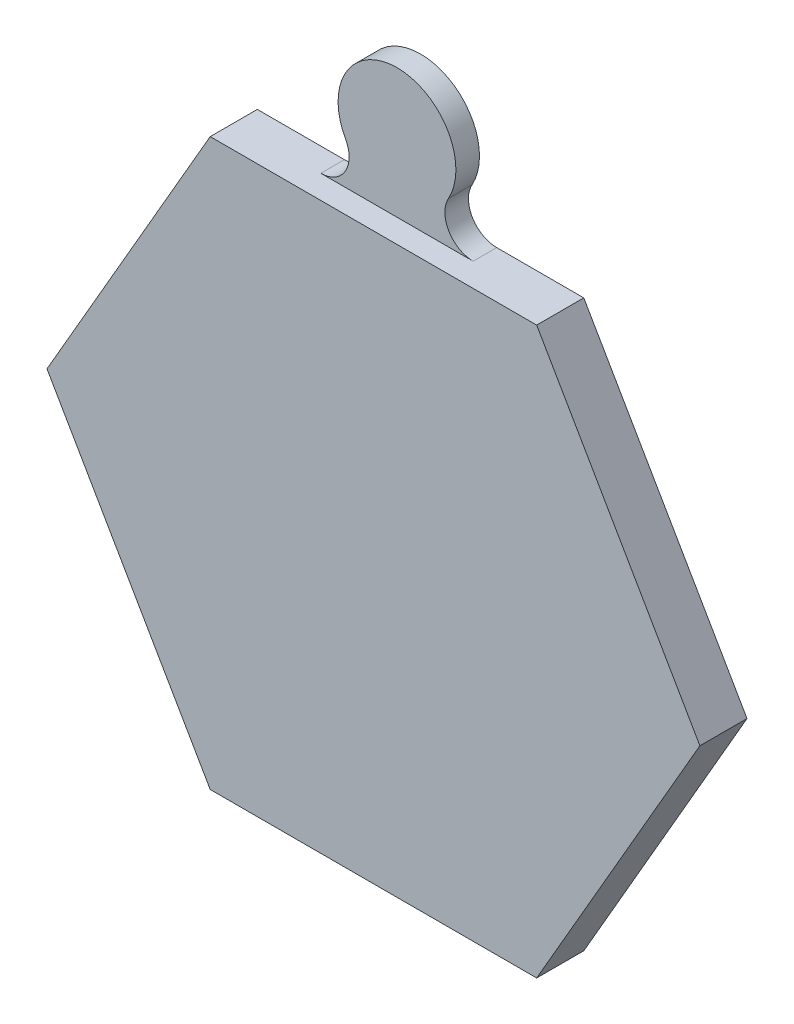
ISO-10303-21;
HEADER;
FILE_DESCRIPTION(('STEP AP214'),'2;1');
FILE_NAME('part.step','',(''),(''),'','','');
FILE_SCHEMA(('AUTOMOTIVE_DESIGN { 1 0 10303 214 1 1 1 1 }'));
ENDSEC;
DATA;
#1=APPLICATION_CONTEXT('core data for automotive mechanical design processes');
#2=APPLICATION_PROTOCOL_DEFINITION('international standard','automotive_design',2000,#1);
#3=PRODUCT_CONTEXT('',#1,'mechanical');
#4=PRODUCT('Part','Part','',(#3));
#5=PRODUCT_RELATED_PRODUCT_CATEGORY('part','',(#4));
#6=PRODUCT_DEFINITION_FORMATION('','',#4);
#7=PRODUCT_DEFINITION_CONTEXT('part definition',#1,'design');
#8=PRODUCT_DEFINITION('design','',#6,#7);
#9=PRODUCT_DEFINITION_SHAPE('','',#8);
#10=(LENGTH_UNIT() NAMED_UNIT(*) SI_UNIT(.MILLI.,.METRE.));
#11=(NAMED_UNIT(*) PLANE_ANGLE_UNIT() SI_UNIT($,.RADIAN.));
#12=(NAMED_UNIT(*) SI_UNIT($,.STERADIAN.) SOLID_ANGLE_UNIT());
#13=UNCERTAINTY_MEASURE_WITH_UNIT(LENGTH_MEASURE(1.E-05),#10,'distance_accuracy_value','');
#14=(GEOMETRIC_REPRESENTATION_CONTEXT(3) GLOBAL_UNCERTAINTY_ASSIGNED_CONTEXT((#13)) GLOBAL_UNIT_ASSIGNED_CONTEXT((#10,
#11,#12)) REPRESENTATION_CONTEXT('',''));
#15=CARTESIAN_POINT('',(0.,0.,0.));
#16=DIRECTION('',(0.,0.,1.));
#17=DIRECTION('',(1.,0.,0.));
#18=AXIS2_PLACEMENT_3D('',#15,#16,#17);
#19=CARTESIAN_POINT('',(34.6410161513775,60.,10.));
#20=DIRECTION('',(0.,-1.,0.));
#21=DIRECTION('',(1.,0.,0.));
#22=AXIS2_PLACEMENT_3D('',#19,#20,#21);
#23=PLANE('',#22);
#24=DIRECTION('',(0.,0.,-1.));
#25=VECTOR('',#24,1.);
#26=CARTESIAN_POINT('',(-16.1632298752446,60.,5.));
#27=LINE('',#26,#25);
#28=CARTESIAN_POINT('',(-16.1632298752446,60.,5.));
#29=VERTEX_POINT('',#28);
#30=CARTESIAN_POINT('',(-16.1632298752446,60.,0.));
#31=VERTEX_POINT('',#30);
#32=EDGE_CURVE('E215',#29,#31,#27,.T.);
#33=ORIENTED_EDGE('',*,*,#32,.T.);
#34=DIRECTION('',(-1.,0.,0.));
#35=VECTOR('',#34,1.);
#36=CARTESIAN_POINT('',(34.6410161513775,60.,0.));
#37=LINE('',#36,#35);
#38=CARTESIAN_POINT('',(-34.6410161513776,60.,0.));
#39=VERTEX_POINT('',#38);
#40=EDGE_CURVE('E254',#31,#39,#37,.T.);
#41=ORIENTED_EDGE('',*,*,#40,.T.);
#42=DIRECTION('',(0.,0.,-1.));
#43=VECTOR('',#42,1.);
#44=CARTESIAN_POINT('',(-34.6410161513776,60.,10.));
#45=LINE('',#44,#43);
#46=CARTESIAN_POINT('',(-34.6410161513776,60.,10.));
#47=VERTEX_POINT('',#46);
#48=EDGE_CURVE('E279',#47,#39,#45,.T.);
#49=ORIENTED_EDGE('',*,*,#48,.F.);
#50=DIRECTION('',(-1.,0.,0.));
#51=VECTOR('',#50,1.);
#52=CARTESIAN_POINT('',(34.6410161513775,60.,10.));
#53=LINE('',#52,#51);
#54=CARTESIAN_POINT('',(34.6410161513775,60.,10.));
#55=VERTEX_POINT('',#54);
#56=EDGE_CURVE('E235',#55,#47,#53,.T.);
#57=ORIENTED_EDGE('',*,*,#56,.F.);
#58=DIRECTION('',(0.,0.,-1.));
#59=VECTOR('',#58,1.);
#60=CARTESIAN_POINT('',(34.6410161513775,60.,10.));
#61=LINE('',#60,#59);
#62=CARTESIAN_POINT('',(34.6410161513775,60.,0.));
#63=VERTEX_POINT('',#62);
#64=EDGE_CURVE('E48',#55,#63,#61,.T.);
#65=ORIENTED_EDGE('',*,*,#64,.T.);
#66=CARTESIAN_POINT('',(16.1632298752446,60.,0.));
#67=VERTEX_POINT('',#66);
#68=EDGE_CURVE('E255',#63,#67,#37,.T.);
#69=ORIENTED_EDGE('',*,*,#68,.T.);
#70=DIRECTION('',(0.,0.,-1.));
#71=VECTOR('',#70,1.);
#72=CARTESIAN_POINT('',(16.1632298752446,60.,5.));
#73=LINE('',#72,#71);
#74=CARTESIAN_POINT('',(16.1632298752446,60.,5.));
#75=VERTEX_POINT('',#74);
#76=EDGE_CURVE('E63',#75,#67,#73,.T.);
#77=ORIENTED_EDGE('',*,*,#76,.F.);
#78=DIRECTION('',(-1.,0.,0.));
#79=VECTOR('',#78,1.);
#80=CARTESIAN_POINT('',(16.1632298752446,60.,5.));
#81=LINE('',#80,#79);
#82=EDGE_CURVE('E201',#75,#29,#81,.T.);
#83=ORIENTED_EDGE('',*,*,#82,.T.);
#84=EDGE_LOOP('',(#33,#41,#49,#57,#65,#69,#77,#83));
#85=FACE_BOUND('',#84,.T.);
#86=ADVANCED_FACE('F39',(#85),#23,.F.);
#87=CARTESIAN_POINT('',(34.6410161513776,-60.,10.));
#88=DIRECTION('',(-0.866025403784439,0.499999999999999,0.));
#89=DIRECTION('',(-0.499999999999999,-0.866025403784439,0.));
#90=AXIS2_PLACEMENT_3D('',#87,#88,#89);
#91=PLANE('',#90);
#92=DIRECTION('',(0.499999999999999,0.866025403784439,0.));
#93=VECTOR('',#92,1.);
#94=CARTESIAN_POINT('',(34.6410161513776,-60.,0.));
#95=LINE('',#94,#93);
#96=CARTESIAN_POINT('',(34.6410161513776,-60.,0.));
#97=VERTEX_POINT('',#96);
#98=CARTESIAN_POINT('',(69.2820323027551,0.,0.));
#99=VERTEX_POINT('',#98);
#100=EDGE_CURVE('E219',#97,#99,#95,.T.);
#101=ORIENTED_EDGE('',*,*,#100,.T.);
#102=DIRECTION('',(0.,0.,-1.));
#103=VECTOR('',#102,1.);
#104=CARTESIAN_POINT('',(69.2820323027551,0.,10.));
#105=LINE('',#104,#103);
#106=CARTESIAN_POINT('',(69.2820323027551,0.,10.));
#107=VERTEX_POINT('',#106);
#108=EDGE_CURVE('E11',#107,#99,#105,.T.);
#109=ORIENTED_EDGE('',*,*,#108,.F.);
#110=DIRECTION('',(0.499999999999999,0.866025403784439,0.));
#111=VECTOR('',#110,1.);
#112=CARTESIAN_POINT('',(34.6410161513776,-60.,10.));
#113=LINE('',#112,#111);
#114=CARTESIAN_POINT('',(34.6410161513776,-60.,10.));
#115=VERTEX_POINT('',#114);
#116=EDGE_CURVE('E227',#115,#107,#113,.T.);
#117=ORIENTED_EDGE('',*,*,#116,.F.);
#118=DIRECTION('',(0.,0.,-1.));
#119=VECTOR('',#118,1.);
#120=CARTESIAN_POINT('',(34.6410161513776,-60.,10.));
#121=LINE('',#120,#119);
#122=EDGE_CURVE('E247',#115,#97,#121,.T.);
#123=ORIENTED_EDGE('',*,*,#122,.T.);
#124=EDGE_LOOP('',(#101,#109,#117,#123));
#125=FACE_BOUND('',#124,.T.);
#126=ADVANCED_FACE('F41',(#125),#91,.F.);
#127=CARTESIAN_POINT('',(69.2820323027551,0.,10.));
#128=DIRECTION('',(-0.866025403784438,-0.5,0.));
#129=DIRECTION('',(0.5,-0.866025403784438,0.));
#130=AXIS2_PLACEMENT_3D('',#127,#128,#129);
#131=PLANE('',#130);
#132=DIRECTION('',(-0.5,0.866025403784439,0.));
#133=VECTOR('',#132,1.);
#134=CARTESIAN_POINT('',(69.2820323027551,0.,0.));
#135=LINE('',#134,#133);
#136=EDGE_CURVE('E251',#99,#63,#135,.T.);
#137=ORIENTED_EDGE('',*,*,#136,.T.);
#138=ORIENTED_EDGE('',*,*,#64,.F.);
#139=DIRECTION('',(-0.5,0.866025403784439,0.));
#140=VECTOR('',#139,1.);
#141=CARTESIAN_POINT('',(69.2820323027551,0.,10.));
#142=LINE('',#141,#140);
#143=EDGE_CURVE('E231',#107,#55,#142,.T.);
#144=ORIENTED_EDGE('',*,*,#143,.F.);
#145=ORIENTED_EDGE('',*,*,#108,.T.);
#146=EDGE_LOOP('',(#137,#138,#144,#145));
#147=FACE_BOUND('',#146,.T.);
#148=ADVANCED_FACE('F340',(#147),#131,.F.);
#149=CARTESIAN_POINT('',(-34.6410161513776,60.,10.));
#150=DIRECTION('',(0.866025403784439,-0.5,0.));
#151=DIRECTION('',(0.5,0.866025403784439,0.));
#152=AXIS2_PLACEMENT_3D('',#149,#150,#151);
#153=PLANE('',#152);
#154=DIRECTION('',(-0.5,-0.866025403784439,0.));
#155=VECTOR('',#154,1.);
#156=CARTESIAN_POINT('',(-34.6410161513776,60.,0.));
#157=LINE('',#156,#155);
#158=CARTESIAN_POINT('',(-69.2820323027551,0.,0.));
#159=VERTEX_POINT('',#158);
#160=EDGE_CURVE('E258',#39,#159,#157,.T.);
#161=ORIENTED_EDGE('',*,*,#160,.T.);
#162=DIRECTION('',(0.,0.,-1.));
#163=VECTOR('',#162,1.);
#164=CARTESIAN_POINT('',(-69.2820323027551,0.,10.));
#165=LINE('',#164,#163);
#166=CARTESIAN_POINT('',(-69.2820323027551,0.,10.));
#167=VERTEX_POINT('',#166);
#168=EDGE_CURVE('E275',#167,#159,#165,.T.);
#169=ORIENTED_EDGE('',*,*,#168,.F.);
#170=DIRECTION('',(-0.5,-0.866025403784439,0.));
#171=VECTOR('',#170,1.);
#172=CARTESIAN_POINT('',(-34.6410161513776,60.,10.));
#173=LINE('',#172,#171);
#174=EDGE_CURVE('E238',#47,#167,#173,.T.);
#175=ORIENTED_EDGE('',*,*,#174,.F.);
#176=ORIENTED_EDGE('',*,*,#48,.T.);
#177=EDGE_LOOP('',(#161,#169,#175,#176));
#178=FACE_BOUND('',#177,.T.);
#179=ADVANCED_FACE('F342',(#178),#153,.F.);
#180=CARTESIAN_POINT('',(-69.2820323027551,0.,10.));
#181=DIRECTION('',(0.866025403784438,0.5,0.));
#182=DIRECTION('',(-0.500000000000001,0.866025403784438,0.));
#183=AXIS2_PLACEMENT_3D('',#180,#181,#182);
#184=PLANE('',#183);
#185=DIRECTION('',(0.5,-0.866025403784438,0.));
#186=VECTOR('',#185,1.);
#187=CARTESIAN_POINT('',(-69.2820323027551,0.,0.));
#188=LINE('',#187,#186);
#189=CARTESIAN_POINT('',(-34.6410161513776,-60.,0.));
#190=VERTEX_POINT('',#189);
#191=EDGE_CURVE('E261',#159,#190,#188,.T.);
#192=ORIENTED_EDGE('',*,*,#191,.T.);
#193=DIRECTION('',(0.,0.,-1.));
#194=VECTOR('',#193,1.);
#195=CARTESIAN_POINT('',(-34.6410161513776,-60.,10.));
#196=LINE('',#195,#194);
#197=CARTESIAN_POINT('',(-34.6410161513776,-60.,10.));
#198=VERTEX_POINT('',#197);
#199=EDGE_CURVE('E271',#198,#190,#196,.T.);
#200=ORIENTED_EDGE('',*,*,#199,.F.);
#201=DIRECTION('',(0.5,-0.866025403784438,0.));
#202=VECTOR('',#201,1.);
#203=CARTESIAN_POINT('',(-69.2820323027551,0.,10.));
#204=LINE('',#203,#202);
#205=EDGE_CURVE('E241',#167,#198,#204,.T.);
#206=ORIENTED_EDGE('',*,*,#205,.F.);
#207=ORIENTED_EDGE('',*,*,#168,.T.);
#208=EDGE_LOOP('',(#192,#200,#206,#207));
#209=FACE_BOUND('',#208,.T.);
#210=ADVANCED_FACE('F348',(#209),#184,.F.);
#211=CARTESIAN_POINT('',(-34.6410161513776,-60.,10.));
#212=DIRECTION('',(0.,1.,0.));
#213=DIRECTION('',(-1.,0.,0.));
#214=AXIS2_PLACEMENT_3D('',#211,#212,#213);
#215=PLANE('',#214);
#216=DIRECTION('',(1.,0.,0.));
#217=VECTOR('',#216,1.);
#218=CARTESIAN_POINT('',(-34.6410161513776,-60.,0.));
#219=LINE('',#218,#217);
#220=CARTESIAN_POINT('',(-16.2775919595007,-60.,0.));
#221=VERTEX_POINT('',#220);
#222=EDGE_CURVE('E232',#190,#221,#219,.T.);
#223=ORIENTED_EDGE('',*,*,#222,.T.);
#224=DIRECTION('',(0.,0.,-1.));
#225=VECTOR('',#224,1.);
#226=CARTESIAN_POINT('',(-16.2775919595007,-60.,5.));
#227=LINE('',#226,#225);
#228=CARTESIAN_POINT('',(-16.2775919595007,-60.,5.));
#229=VERTEX_POINT('',#228);
#230=EDGE_CURVE('E179',#229,#221,#227,.T.);
#231=ORIENTED_EDGE('',*,*,#230,.F.);
#232=DIRECTION('',(-1.,0.,0.));
#233=VECTOR('',#232,1.);
#234=CARTESIAN_POINT('',(0.,-60.,5.));
#235=LINE('',#234,#233);
#236=CARTESIAN_POINT('',(16.2775919595006,-60.,5.));
#237=VERTEX_POINT('',#236);
#238=EDGE_CURVE('E149',#237,#229,#235,.T.);
#239=ORIENTED_EDGE('',*,*,#238,.F.);
#240=DIRECTION('',(0.,0.,-1.));
#241=VECTOR('',#240,1.);
#242=CARTESIAN_POINT('',(16.2775919595006,-60.,5.));
#243=LINE('',#242,#241);
#244=CARTESIAN_POINT('',(16.2775919595006,-60.,0.));
#245=VERTEX_POINT('',#244);
#246=EDGE_CURVE('E183',#237,#245,#243,.T.);
#247=ORIENTED_EDGE('',*,*,#246,.T.);
#248=EDGE_CURVE('E264',#245,#97,#219,.T.);
#249=ORIENTED_EDGE('',*,*,#248,.T.);
#250=ORIENTED_EDGE('',*,*,#122,.F.);
#251=DIRECTION('',(1.,0.,0.));
#252=VECTOR('',#251,1.);
#253=CARTESIAN_POINT('',(-34.6410161513776,-60.,10.));
#254=LINE('',#253,#252);
#255=EDGE_CURVE('E244',#198,#115,#254,.T.);
#256=ORIENTED_EDGE('',*,*,#255,.F.);
#257=ORIENTED_EDGE('',*,*,#199,.T.);
#258=EDGE_LOOP('',(#223,#231,#239,#247,#249,#250,#256,#257));
#259=FACE_BOUND('',#258,.T.);
#260=ADVANCED_FACE('F313',(#259),#215,.F.);
#261=CARTESIAN_POINT('',(0.,0.,10.));
#262=DIRECTION('',(0.,0.,1.));
#263=DIRECTION('',(1.,0.,0.));
#264=AXIS2_PLACEMENT_3D('',#261,#262,#263);
#265=PLANE('',#264);
#266=ORIENTED_EDGE('',*,*,#116,.T.);
#267=ORIENTED_EDGE('',*,*,#143,.T.);
#268=ORIENTED_EDGE('',*,*,#56,.T.);
#269=ORIENTED_EDGE('',*,*,#174,.T.);
#270=ORIENTED_EDGE('',*,*,#205,.T.);
#271=ORIENTED_EDGE('',*,*,#255,.T.);
#272=EDGE_LOOP('',(#266,#267,#268,#269,#270,#271));
#273=FACE_BOUND('',#272,.T.);
#274=ADVANCED_FACE('F319',(#273),#265,.T.);
#275=CARTESIAN_POINT('',(0.,0.,0.));
#276=DIRECTION('',(0.,0.,1.));
#277=DIRECTION('',(1.,0.,0.));
#278=AXIS2_PLACEMENT_3D('',#275,#276,#277);
#279=PLANE('',#278);
#280=CARTESIAN_POINT('',(0.,-45.,0.));
#281=DIRECTION('',(0.,0.,-1.));
#282=DIRECTION('',(-1.,0.,0.));
#283=AXIS2_PLACEMENT_3D('',#280,#281,#282);
#284=CIRCLE('',#283,12.6);
#285=CARTESIAN_POINT('',(-11.0267558435327,-51.0967741935484,0.));
#286=VERTEX_POINT('',#285);
#287=CARTESIAN_POINT('',(11.0267558435327,-51.0967741935484,0.));
#288=VERTEX_POINT('',#287);
#289=EDGE_CURVE('E168',#286,#288,#284,.T.);
#290=ORIENTED_EDGE('',*,*,#289,.F.);
#291=CARTESIAN_POINT('',(-16.2775919595007,-54.,0.));
#292=DIRECTION('',(0.,0.,-1.));
#293=DIRECTION('',(-1.,0.,0.));
#294=AXIS2_PLACEMENT_3D('',#291,#292,#293);
#295=CIRCLE('',#294,6.);
#296=EDGE_CURVE('E55',#221,#286,#295,.F.);
#297=ORIENTED_EDGE('',*,*,#296,.F.);
#298=ORIENTED_EDGE('',*,*,#222,.F.);
#299=ORIENTED_EDGE('',*,*,#191,.F.);
#300=ORIENTED_EDGE('',*,*,#160,.F.);
#301=ORIENTED_EDGE('',*,*,#40,.F.);
#302=CARTESIAN_POINT('',(-16.1632298752446,66.,0.));
#303=DIRECTION('',(0.,0.,1.));
#304=DIRECTION('',(-1.,0.,0.));
#305=AXIS2_PLACEMENT_3D('',#302,#303,#304);
#306=CIRCLE('',#305,6.);
#307=CARTESIAN_POINT('',(-10.9211012670572,68.9189189189189,0.));
#308=VERTEX_POINT('',#307);
#309=EDGE_CURVE('E182',#31,#308,#306,.T.);
#310=ORIENTED_EDGE('',*,*,#309,.T.);
#311=CARTESIAN_POINT('',(0.,75.,0.));
#312=DIRECTION('',(0.,0.,-1.));
#313=DIRECTION('',(-1.,0.,0.));
#314=AXIS2_PLACEMENT_3D('',#311,#312,#313);
#315=CIRCLE('',#314,12.5);
#316=CARTESIAN_POINT('',(10.9211012670572,68.9189189189189,0.));
#317=VERTEX_POINT('',#316);
#318=EDGE_CURVE('E208',#308,#317,#315,.T.);
#319=ORIENTED_EDGE('',*,*,#318,.T.);
#320=CARTESIAN_POINT('',(16.1632298752446,66.,0.));
#321=DIRECTION('',(0.,0.,1.));
#322=DIRECTION('',(1.,0.,0.));
#323=AXIS2_PLACEMENT_3D('',#320,#321,#322);
#324=CIRCLE('',#323,6.00000000000001);
#325=EDGE_CURVE('E194',#317,#67,#324,.T.);
#326=ORIENTED_EDGE('',*,*,#325,.T.);
#327=ORIENTED_EDGE('',*,*,#68,.F.);
#328=ORIENTED_EDGE('',*,*,#136,.F.);
#329=ORIENTED_EDGE('',*,*,#100,.F.);
#330=ORIENTED_EDGE('',*,*,#248,.F.);
#331=CARTESIAN_POINT('',(16.2775919595006,-54.,0.));
#332=DIRECTION('',(0.,0.,-1.));
#333=DIRECTION('',(-1.,0.,0.));
#334=AXIS2_PLACEMENT_3D('',#331,#332,#333);
#335=CIRCLE('',#334,6.);
#336=EDGE_CURVE('E164',#245,#288,#335,.T.);
#337=ORIENTED_EDGE('',*,*,#336,.T.);
#338=EDGE_LOOP('',(#290,#297,#298,#299,#300,#301,#310,#319,#326,#327,#328,#329,#330,#337));
#339=FACE_BOUND('',#338,.T.);
#340=ADVANCED_FACE('F290',(#339),#279,.F.);
#341=CARTESIAN_POINT('',(-16.1632298752446,66.,5.));
#342=DIRECTION('',(0.,0.,-1.));
#343=DIRECTION('',(-1.,0.,0.));
#344=AXIS2_PLACEMENT_3D('',#341,#342,#343);
#345=CYLINDRICAL_SURFACE('',#344,6.);
#346=ORIENTED_EDGE('',*,*,#309,.F.);
#347=ORIENTED_EDGE('',*,*,#32,.F.);
#348=CARTESIAN_POINT('',(-16.1632298752446,66.,5.));
#349=DIRECTION('',(0.,0.,1.));
#350=DIRECTION('',(-1.,0.,0.));
#351=AXIS2_PLACEMENT_3D('',#348,#349,#350);
#352=CIRCLE('',#351,6.);
#353=CARTESIAN_POINT('',(-10.9211012670572,68.9189189189189,5.));
#354=VERTEX_POINT('',#353);
#355=EDGE_CURVE('E189',#29,#354,#352,.T.);
#356=ORIENTED_EDGE('',*,*,#355,.T.);
#357=DIRECTION('',(0.,0.,-1.));
#358=VECTOR('',#357,1.);
#359=CARTESIAN_POINT('',(-10.9211012670572,68.9189189189189,5.));
#360=LINE('',#359,#358);
#361=EDGE_CURVE('E204',#354,#308,#360,.T.);
#362=ORIENTED_EDGE('',*,*,#361,.T.);
#363=EDGE_LOOP('',(#346,#347,#356,#362));
#364=FACE_BOUND('',#363,.T.);
#365=ADVANCED_FACE('F305',(#364),#345,.F.);
#366=CARTESIAN_POINT('',(16.1632298752446,66.,5.));
#367=DIRECTION('',(0.,0.,-1.));
#368=DIRECTION('',(-1.,0.,0.));
#369=AXIS2_PLACEMENT_3D('',#366,#367,#368);
#370=CYLINDRICAL_SURFACE('',#369,6.00000000000001);
#371=ORIENTED_EDGE('',*,*,#325,.F.);
#372=DIRECTION('',(0.,0.,-1.));
#373=VECTOR('',#372,1.);
#374=CARTESIAN_POINT('',(10.9211012670572,68.9189189189189,5.));
#375=LINE('',#374,#373);
#376=CARTESIAN_POINT('',(10.9211012670572,68.9189189189189,5.));
#377=VERTEX_POINT('',#376);
#378=EDGE_CURVE('E222',#377,#317,#375,.T.);
#379=ORIENTED_EDGE('',*,*,#378,.F.);
#380=CARTESIAN_POINT('',(16.1632298752446,66.,5.));
#381=DIRECTION('',(0.,0.,1.));
#382=DIRECTION('',(1.,0.,0.));
#383=AXIS2_PLACEMENT_3D('',#380,#381,#382);
#384=CIRCLE('',#383,6.00000000000001);
#385=EDGE_CURVE('E198',#377,#75,#384,.T.);
#386=ORIENTED_EDGE('',*,*,#385,.T.);
#387=ORIENTED_EDGE('',*,*,#76,.T.);
#388=EDGE_LOOP('',(#371,#379,#386,#387));
#389=FACE_BOUND('',#388,.T.);
#390=ADVANCED_FACE('F295',(#389),#370,.F.);
#391=CARTESIAN_POINT('',(0.,75.,5.));
#392=DIRECTION('',(0.,0.,-1.));
#393=DIRECTION('',(-1.,0.,0.));
#394=AXIS2_PLACEMENT_3D('',#391,#392,#393);
#395=CYLINDRICAL_SURFACE('',#394,12.5);
#396=ORIENTED_EDGE('',*,*,#318,.F.);
#397=ORIENTED_EDGE('',*,*,#361,.F.);
#398=CARTESIAN_POINT('',(0.,75.,5.));
#399=DIRECTION('',(0.,0.,-1.));
#400=DIRECTION('',(-1.,0.,0.));
#401=AXIS2_PLACEMENT_3D('',#398,#399,#400);
#402=CIRCLE('',#401,12.5);
#403=EDGE_CURVE('E193',#354,#377,#402,.T.);
#404=ORIENTED_EDGE('',*,*,#403,.T.);
#405=ORIENTED_EDGE('',*,*,#378,.T.);
#406=EDGE_LOOP('',(#396,#397,#404,#405));
#407=FACE_BOUND('',#406,.T.);
#408=ADVANCED_FACE('F366',(#407),#395,.T.);
#409=CARTESIAN_POINT('',(-16.1632298752446,66.,5.));
#410=DIRECTION('',(0.,0.,-1.));
#411=DIRECTION('',(-1.,0.,0.));
#412=AXIS2_PLACEMENT_3D('',#409,#410,#411);
#413=PLANE('',#412);
#414=ORIENTED_EDGE('',*,*,#355,.F.);
#415=ORIENTED_EDGE('',*,*,#82,.F.);
#416=ORIENTED_EDGE('',*,*,#385,.F.);
#417=ORIENTED_EDGE('',*,*,#403,.F.);
#418=EDGE_LOOP('',(#414,#415,#416,#417));
#419=FACE_BOUND('',#418,.T.);
#420=ADVANCED_FACE('F301',(#419),#413,.F.);
#421=CARTESIAN_POINT('',(-16.2775919595007,-54.,5.));
#422=DIRECTION('',(0.,0.,-1.));
#423=DIRECTION('',(-1.,0.,0.));
#424=AXIS2_PLACEMENT_3D('',#421,#422,#423);
#425=CYLINDRICAL_SURFACE('',#424,6.);
#426=ORIENTED_EDGE('',*,*,#296,.T.);
#427=DIRECTION('',(0.,0.,-1.));
#428=VECTOR('',#427,1.);
#429=CARTESIAN_POINT('',(-11.0267558435327,-51.0967741935484,5.));
#430=LINE('',#429,#428);
#431=CARTESIAN_POINT('',(-11.0267558435327,-51.0967741935484,5.));
#432=VERTEX_POINT('',#431);
#433=EDGE_CURVE('E138',#432,#286,#430,.T.);
#434=ORIENTED_EDGE('',*,*,#433,.F.);
#435=CARTESIAN_POINT('',(-16.2775919595007,-54.,5.));
#436=DIRECTION('',(0.,0.,-1.));
#437=DIRECTION('',(-1.,0.,0.));
#438=AXIS2_PLACEMENT_3D('',#435,#436,#437);
#439=CIRCLE('',#438,6.);
#440=EDGE_CURVE('E142',#229,#432,#439,.F.);
#441=ORIENTED_EDGE('',*,*,#440,.F.);
#442=ORIENTED_EDGE('',*,*,#230,.T.);
#443=EDGE_LOOP('',(#426,#434,#441,#442));
#444=FACE_BOUND('',#443,.T.);
#445=ADVANCED_FACE('F140',(#444),#425,.T.);
#446=CARTESIAN_POINT('',(16.2775919595006,-54.,5.));
#447=DIRECTION('',(0.,0.,-1.));
#448=DIRECTION('',(-1.,0.,0.));
#449=AXIS2_PLACEMENT_3D('',#446,#447,#448);
#450=CYLINDRICAL_SURFACE('',#449,6.);
#451=ORIENTED_EDGE('',*,*,#336,.F.);
#452=ORIENTED_EDGE('',*,*,#246,.F.);
#453=CARTESIAN_POINT('',(16.2775919595006,-54.,5.));
#454=DIRECTION('',(0.,0.,-1.));
#455=DIRECTION('',(-1.,0.,0.));
#456=AXIS2_PLACEMENT_3D('',#453,#454,#455);
#457=CIRCLE('',#456,6.);
#458=CARTESIAN_POINT('',(11.0267558435327,-51.0967741935484,5.));
#459=VERTEX_POINT('',#458);
#460=EDGE_CURVE('E158',#237,#459,#457,.T.);
#461=ORIENTED_EDGE('',*,*,#460,.T.);
#462=DIRECTION('',(0.,0.,-1.));
#463=VECTOR('',#462,1.);
#464=CARTESIAN_POINT('',(11.0267558435327,-51.0967741935484,5.));
#465=LINE('',#464,#463);
#466=EDGE_CURVE('E148',#459,#288,#465,.T.);
#467=ORIENTED_EDGE('',*,*,#466,.T.);
#468=EDGE_LOOP('',(#451,#452,#461,#467));
#469=FACE_BOUND('',#468,.T.);
#470=ADVANCED_FACE('F325',(#469),#450,.T.);
#471=CARTESIAN_POINT('',(0.,-45.,5.));
#472=DIRECTION('',(0.,0.,-1.));
#473=DIRECTION('',(-1.,0.,0.));
#474=AXIS2_PLACEMENT_3D('',#471,#472,#473);
#475=CYLINDRICAL_SURFACE('',#474,12.6);
#476=ORIENTED_EDGE('',*,*,#289,.T.);
#477=ORIENTED_EDGE('',*,*,#466,.F.);
#478=CARTESIAN_POINT('',(0.,-45.,5.));
#479=DIRECTION('',(0.,0.,-1.));
#480=DIRECTION('',(-1.,0.,0.));
#481=AXIS2_PLACEMENT_3D('',#478,#479,#480);
#482=CIRCLE('',#481,12.6);
#483=EDGE_CURVE('E153',#432,#459,#482,.T.);
#484=ORIENTED_EDGE('',*,*,#483,.F.);
#485=ORIENTED_EDGE('',*,*,#433,.T.);
#486=EDGE_LOOP('',(#476,#477,#484,#485));
#487=FACE_BOUND('',#486,.T.);
#488=ADVANCED_FACE('F154',(#487),#475,.F.);
#489=CARTESIAN_POINT('',(0.,0.,5.));
#490=DIRECTION('',(0.,0.,-1.));
#491=DIRECTION('',(-1.,0.,0.));
#492=AXIS2_PLACEMENT_3D('',#489,#490,#491);
#493=PLANE('',#492);
#494=ORIENTED_EDGE('',*,*,#440,.T.);
#495=ORIENTED_EDGE('',*,*,#483,.T.);
#496=ORIENTED_EDGE('',*,*,#460,.F.);
#497=ORIENTED_EDGE('',*,*,#238,.T.);
#498=EDGE_LOOP('',(#494,#495,#496,#497));
#499=FACE_BOUND('',#498,.T.);
#500=ADVANCED_FACE('F160',(#499),#493,.T.);
#501=CLOSED_SHELL('',(#86,#126,#148,#179,#210,#260,#274,#340,#365,#390,#408,#420,#445,#470,#488,#500));
#502=MANIFOLD_SOLID_BREP('B2',#501);
#503=ADVANCED_BREP_SHAPE_REPRESENTATION('',(#18,#502),#14);
#504=SHAPE_DEFINITION_REPRESENTATION(#9,#503);
ENDSEC;
END-ISO-10303-21;
